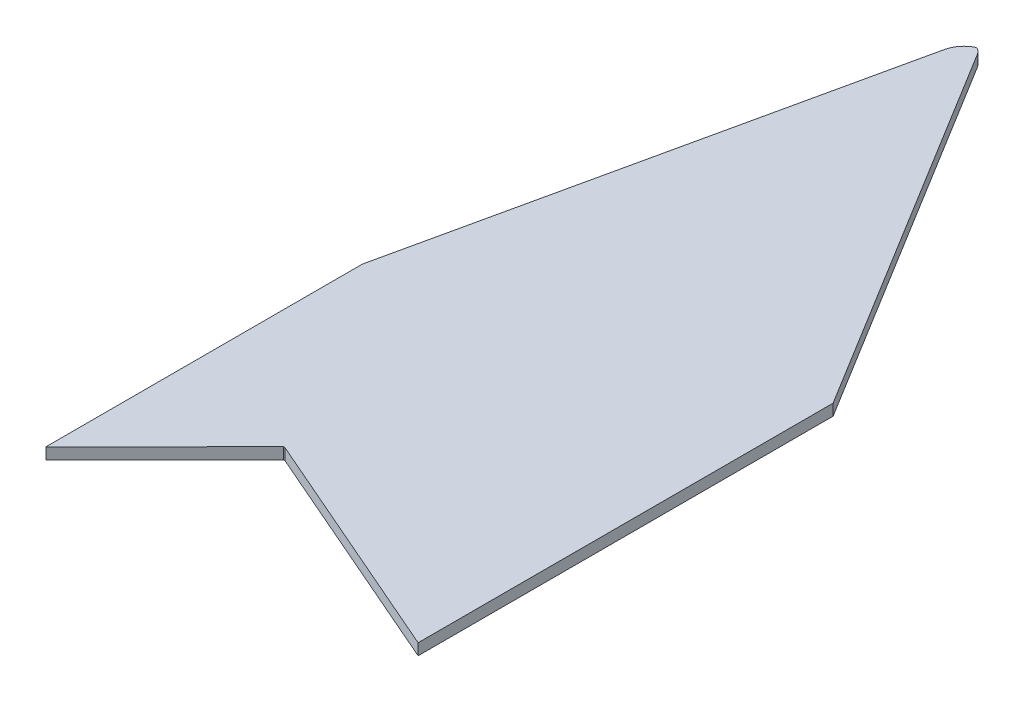
ISO-10303-21;
HEADER;
FILE_DESCRIPTION(('STEP AP214'),'2;1');
FILE_NAME('part.step','',(''),(''),'','','');
FILE_SCHEMA(('AUTOMOTIVE_DESIGN { 1 0 10303 214 1 1 1 1 }'));
ENDSEC;
DATA;
#1=APPLICATION_CONTEXT('core data for automotive mechanical design processes');
#2=APPLICATION_PROTOCOL_DEFINITION('international standard','automotive_design',2000,#1);
#3=PRODUCT_CONTEXT('',#1,'mechanical');
#4=PRODUCT('Part','Part','',(#3));
#5=PRODUCT_RELATED_PRODUCT_CATEGORY('part','',(#4));
#6=PRODUCT_DEFINITION_FORMATION('','',#4);
#7=PRODUCT_DEFINITION_CONTEXT('part definition',#1,'design');
#8=PRODUCT_DEFINITION('design','',#6,#7);
#9=PRODUCT_DEFINITION_SHAPE('','',#8);
#10=(LENGTH_UNIT() NAMED_UNIT(*) SI_UNIT(.MILLI.,.METRE.));
#11=(NAMED_UNIT(*) PLANE_ANGLE_UNIT() SI_UNIT($,.RADIAN.));
#12=(NAMED_UNIT(*) SI_UNIT($,.STERADIAN.) SOLID_ANGLE_UNIT());
#13=UNCERTAINTY_MEASURE_WITH_UNIT(LENGTH_MEASURE(1.E-05),#10,'distance_accuracy_value','');
#14=(GEOMETRIC_REPRESENTATION_CONTEXT(3) GLOBAL_UNCERTAINTY_ASSIGNED_CONTEXT((#13)) GLOBAL_UNIT_ASSIGNED_CONTEXT((#10,
#11,#12)) REPRESENTATION_CONTEXT('',''));
#15=CARTESIAN_POINT('',(0.,0.,0.));
#16=DIRECTION('',(0.,0.,1.));
#17=DIRECTION('',(1.,0.,0.));
#18=AXIS2_PLACEMENT_3D('',#15,#16,#17);
#19=CARTESIAN_POINT('',(17.47942616652,1.27,-10.7409846570753));
#20=DIRECTION('',(-0.85199721938141,0.,0.523546309476388));
#21=DIRECTION('',(0.523546309476388,0.,0.85199721938141));
#22=AXIS2_PLACEMENT_3D('',#19,#20,#21);
#23=PLANE('',#22);
#24=DIRECTION('',(-0.523546309476388,0.,-0.85199721938141));
#25=VECTOR('',#24,1.);
#26=CARTESIAN_POINT('',(17.47942616652,0.,-10.7409846570753));
#27=LINE('',#26,#25);
#28=CARTESIAN_POINT('',(24.1127293444717,0.,0.0537736300779692));
#29=VERTEX_POINT('',#28);
#30=CARTESIAN_POINT('',(-1.77145104882014,0.,-42.0690516518107));
#31=VERTEX_POINT('',#30);
#32=EDGE_CURVE('E143',#29,#31,#27,.T.);
#33=ORIENTED_EDGE('',*,*,#32,.T.);
#34=DIRECTION('',(0.,-1.,0.));
#35=VECTOR('',#34,1.);
#36=CARTESIAN_POINT('',(-1.77145104882014,1.27,-42.0690516518107));
#37=LINE('',#36,#35);
#38=CARTESIAN_POINT('',(-1.77145104882014,1.27,-42.0690516518107));
#39=VERTEX_POINT('',#38);
#40=EDGE_CURVE('E11',#39,#31,#37,.T.);
#41=ORIENTED_EDGE('',*,*,#40,.F.);
#42=DIRECTION('',(-0.523546309476388,0.,-0.85199721938141));
#43=VECTOR('',#42,1.);
#44=CARTESIAN_POINT('',(17.47942616652,1.27,-10.7409846570753));
#45=LINE('',#44,#43);
#46=CARTESIAN_POINT('',(24.1127293444717,1.27,0.0537736300779692));
#47=VERTEX_POINT('',#46);
#48=EDGE_CURVE('E164',#47,#39,#45,.T.);
#49=ORIENTED_EDGE('',*,*,#48,.F.);
#50=DIRECTION('',(0.,-1.,0.));
#51=VECTOR('',#50,1.);
#52=CARTESIAN_POINT('',(24.1127293444717,1.27,0.0537736300779692));
#53=LINE('',#52,#51);
#54=EDGE_CURVE('E139',#47,#29,#53,.T.);
#55=ORIENTED_EDGE('',*,*,#54,.T.);
#56=EDGE_LOOP('',(#33,#41,#49,#55));
#57=FACE_BOUND('',#56,.T.);
#58=ADVANCED_FACE('F41',(#57),#23,.F.);
#59=CARTESIAN_POINT('',(-2.96826414519948,1.27,-41.3336184068555));
#60=DIRECTION('',(0.,-1.,0.));
#61=DIRECTION('',(0.,0.,-1.));
#62=AXIS2_PLACEMENT_3D('',#59,#60,#61);
#63=CYLINDRICAL_SURFACE('',#62,1.40471479149696);
#64=CARTESIAN_POINT('',(-2.96826414519948,0.,-41.3336184068555));
#65=DIRECTION('',(0.,1.,0.));
#66=DIRECTION('',(0.,0.,1.));
#67=AXIS2_PLACEMENT_3D('',#64,#65,#66);
#68=CIRCLE('',#67,1.40471479149696);
#69=CARTESIAN_POINT('',(-2.45286074280754,0.,-42.6403635917532));
#70=VERTEX_POINT('',#69);
#71=EDGE_CURVE('E146',#31,#70,#68,.T.);
#72=ORIENTED_EDGE('',*,*,#71,.T.);
#73=DIRECTION('',(0.,-1.,0.));
#74=VECTOR('',#73,1.);
#75=CARTESIAN_POINT('',(-2.45286074280754,1.27,-42.6403635917532));
#76=LINE('',#75,#74);
#77=CARTESIAN_POINT('',(-2.45286074280754,1.27,-42.6403635917532));
#78=VERTEX_POINT('',#77);
#79=EDGE_CURVE('E49',#78,#70,#76,.T.);
#80=ORIENTED_EDGE('',*,*,#79,.F.);
#81=CARTESIAN_POINT('',(-2.96826414519948,1.27,-41.3336184068555));
#82=DIRECTION('',(0.,1.,0.));
#83=DIRECTION('',(0.,0.,1.));
#84=AXIS2_PLACEMENT_3D('',#81,#82,#83);
#85=CIRCLE('',#84,1.40471479149696);
#86=EDGE_CURVE('E103',#39,#78,#85,.T.);
#87=ORIENTED_EDGE('',*,*,#86,.F.);
#88=ORIENTED_EDGE('',*,*,#40,.T.);
#89=EDGE_LOOP('',(#72,#80,#87,#88));
#90=FACE_BOUND('',#89,.T.);
#91=ADVANCED_FACE('F179',(#90),#63,.T.);
#92=CARTESIAN_POINT('',(-1.20997845007979,1.27,-39.9947419206108));
#93=DIRECTION('',(0.,-1.,0.));
#94=DIRECTION('',(0.,0.,-1.));
#95=AXIS2_PLACEMENT_3D('',#92,#93,#94);
#96=CYLINDRICAL_SURFACE('',#95,2.92302419086715);
#97=CARTESIAN_POINT('',(-1.20997845007979,0.,-39.9947419206108));
#98=DIRECTION('',(0.,1.,0.));
#99=DIRECTION('',(0.,0.,1.));
#100=AXIS2_PLACEMENT_3D('',#97,#98,#99);
#101=CIRCLE('',#100,2.92302419086715);
#102=CARTESIAN_POINT('',(-4.064387109474,0.,-40.6243621438961));
#103=VERTEX_POINT('',#102);
#104=EDGE_CURVE('E149',#103,#70,#101,.F.);
#105=ORIENTED_EDGE('',*,*,#104,.F.);
#106=DIRECTION('',(0.,-1.,0.));
#107=VECTOR('',#106,1.);
#108=CARTESIAN_POINT('',(-4.064387109474,1.27,-40.6243621438961));
#109=LINE('',#108,#107);
#110=CARTESIAN_POINT('',(-4.064387109474,1.27,-40.6243621438961));
#111=VERTEX_POINT('',#110);
#112=EDGE_CURVE('E172',#111,#103,#109,.T.);
#113=ORIENTED_EDGE('',*,*,#112,.F.);
#114=CARTESIAN_POINT('',(-1.20997845007979,1.27,-39.9947419206108));
#115=DIRECTION('',(0.,1.,0.));
#116=DIRECTION('',(0.,0.,1.));
#117=AXIS2_PLACEMENT_3D('',#114,#115,#116);
#118=CIRCLE('',#117,2.92302419086715);
#119=EDGE_CURVE('E178',#111,#78,#118,.F.);
#120=ORIENTED_EDGE('',*,*,#119,.T.);
#121=ORIENTED_EDGE('',*,*,#79,.T.);
#122=EDGE_LOOP('',(#105,#113,#120,#121));
#123=FACE_BOUND('',#122,.T.);
#124=ADVANCED_FACE('F176',(#123),#96,.T.);
#125=CARTESIAN_POINT('',(-12.4208989096152,1.27,-2.73977908493889));
#126=DIRECTION('',(-0.976525842075709,0.,-0.215400277990367));
#127=DIRECTION('',(-0.215400277990367,0.,0.976525842075709));
#128=AXIS2_PLACEMENT_3D('',#125,#126,#127);
#129=PLANE('',#128);
#130=DIRECTION('',(0.215400277990367,0.,-0.976525842075709));
#131=VECTOR('',#130,1.);
#132=CARTESIAN_POINT('',(-12.4208989096152,0.,-2.73977908493889));
#133=LINE('',#132,#131);
#134=CARTESIAN_POINT('',(-15.8872706555283,0.,12.975156938851));
#135=VERTEX_POINT('',#134);
#136=EDGE_CURVE('E152',#135,#103,#133,.T.);
#137=ORIENTED_EDGE('',*,*,#136,.F.);
#138=DIRECTION('',(0.,-1.,0.));
#139=VECTOR('',#138,1.);
#140=CARTESIAN_POINT('',(-15.8872706555283,1.27,12.975156938851));
#141=LINE('',#140,#139);
#142=CARTESIAN_POINT('',(-15.8872706555283,1.27,12.975156938851));
#143=VERTEX_POINT('',#142);
#144=EDGE_CURVE('E170',#143,#135,#141,.T.);
#145=ORIENTED_EDGE('',*,*,#144,.F.);
#146=DIRECTION('',(0.215400277990367,0.,-0.976525842075709));
#147=VECTOR('',#146,1.);
#148=CARTESIAN_POINT('',(-12.4208989096152,1.27,-2.73977908493889));
#149=LINE('',#148,#147);
#150=EDGE_CURVE('E190',#143,#111,#149,.T.);
#151=ORIENTED_EDGE('',*,*,#150,.T.);
#152=ORIENTED_EDGE('',*,*,#112,.T.);
#153=EDGE_LOOP('',(#137,#145,#151,#152));
#154=FACE_BOUND('',#153,.T.);
#155=ADVANCED_FACE('F187',(#154),#129,.T.);
#156=CARTESIAN_POINT('',(-15.8872706555283,1.27,0.));
#157=DIRECTION('',(-1.,0.,0.));
#158=DIRECTION('',(0.,0.,1.));
#159=AXIS2_PLACEMENT_3D('',#156,#157,#158);
#160=PLANE('',#159);
#161=DIRECTION('',(0.,0.,-1.));
#162=VECTOR('',#161,1.);
#163=CARTESIAN_POINT('',(-15.8872706555283,0.,0.));
#164=LINE('',#163,#162);
#165=CARTESIAN_POINT('',(-15.8872706555283,0.,48.546652053357));
#166=VERTEX_POINT('',#165);
#167=EDGE_CURVE('E155',#166,#135,#164,.T.);
#168=ORIENTED_EDGE('',*,*,#167,.F.);
#169=DIRECTION('',(0.,-1.,0.));
#170=VECTOR('',#169,1.);
#171=CARTESIAN_POINT('',(-15.8872706555283,1.27,48.546652053357));
#172=LINE('',#171,#170);
#173=CARTESIAN_POINT('',(-15.8872706555283,1.27,48.546652053357));
#174=VERTEX_POINT('',#173);
#175=EDGE_CURVE('E168',#174,#166,#172,.T.);
#176=ORIENTED_EDGE('',*,*,#175,.F.);
#177=DIRECTION('',(0.,0.,-1.));
#178=VECTOR('',#177,1.);
#179=CARTESIAN_POINT('',(-15.8872706555283,1.27,0.));
#180=LINE('',#179,#178);
#181=EDGE_CURVE('E193',#174,#143,#180,.T.);
#182=ORIENTED_EDGE('',*,*,#181,.T.);
#183=ORIENTED_EDGE('',*,*,#144,.T.);
#184=EDGE_LOOP('',(#168,#176,#182,#183));
#185=FACE_BOUND('',#184,.T.);
#186=ADVANCED_FACE('F224',(#185),#160,.T.);
#187=CARTESIAN_POINT('',(16.3282440274655,1.27,16.3252714733235));
#188=DIRECTION('',(0.707171148452319,0.,0.707042408060951));
#189=DIRECTION('',(0.707042408060951,0.,-0.707171148452319));
#190=AXIS2_PLACEMENT_3D('',#187,#188,#189);
#191=PLANE('',#190);
#192=DIRECTION('',(-0.707042408060951,0.,0.707171148452319));
#193=VECTOR('',#192,1.);
#194=CARTESIAN_POINT('',(16.3282440274655,0.,16.3252714733235));
#195=LINE('',#194,#193);
#196=CARTESIAN_POINT('',(-2.54372552337133,0.,35.2006772886873));
#197=VERTEX_POINT('',#196);
#198=EDGE_CURVE('E158',#197,#166,#195,.T.);
#199=ORIENTED_EDGE('',*,*,#198,.F.);
#200=DIRECTION('',(0.,-1.,0.));
#201=VECTOR('',#200,1.);
#202=CARTESIAN_POINT('',(-2.54372552337133,1.27,35.2006772886873));
#203=LINE('',#202,#201);
#204=CARTESIAN_POINT('',(-2.54372552337133,1.27,35.2006772886873));
#205=VERTEX_POINT('',#204);
#206=EDGE_CURVE('E134',#205,#197,#203,.T.);
#207=ORIENTED_EDGE('',*,*,#206,.F.);
#208=DIRECTION('',(-0.707042408060951,0.,0.707171148452319));
#209=VECTOR('',#208,1.);
#210=CARTESIAN_POINT('',(16.3282440274655,1.27,16.3252714733235));
#211=LINE('',#210,#209);
#212=EDGE_CURVE('E127',#205,#174,#211,.T.);
#213=ORIENTED_EDGE('',*,*,#212,.T.);
#214=ORIENTED_EDGE('',*,*,#175,.T.);
#215=EDGE_LOOP('',(#199,#207,#213,#214));
#216=FACE_BOUND('',#215,.T.);
#217=ADVANCED_FACE('F200',(#216),#191,.T.);
#218=CARTESIAN_POINT('',(0.,1.27,35.2006772886873));
#219=DIRECTION('',(0.,0.,-1.));
#220=DIRECTION('',(-1.,0.,0.));
#221=AXIS2_PLACEMENT_3D('',#218,#219,#220);
#222=PLANE('',#221);
#223=DIRECTION('',(1.,0.,0.));
#224=VECTOR('',#223,1.);
#225=CARTESIAN_POINT('',(0.,0.,35.2006772886873));
#226=LINE('',#225,#224);
#227=CARTESIAN_POINT('',(-2.36199596224373,0.,35.2006772886873));
#228=VERTEX_POINT('',#227);
#229=EDGE_CURVE('E133',#197,#228,#226,.T.);
#230=ORIENTED_EDGE('',*,*,#229,.T.);
#231=DIRECTION('',(0.,-1.,0.));
#232=VECTOR('',#231,1.);
#233=CARTESIAN_POINT('',(-2.36199596224373,1.27,35.2006772886873));
#234=LINE('',#233,#232);
#235=CARTESIAN_POINT('',(-2.36199596224373,1.27,35.2006772886873));
#236=VERTEX_POINT('',#235);
#237=EDGE_CURVE('E130',#236,#228,#234,.T.);
#238=ORIENTED_EDGE('',*,*,#237,.F.);
#239=DIRECTION('',(1.,0.,0.));
#240=VECTOR('',#239,1.);
#241=CARTESIAN_POINT('',(0.,1.27,35.2006772886873));
#242=LINE('',#241,#240);
#243=EDGE_CURVE('E120',#205,#236,#242,.T.);
#244=ORIENTED_EDGE('',*,*,#243,.F.);
#245=ORIENTED_EDGE('',*,*,#206,.T.);
#246=EDGE_LOOP('',(#230,#238,#244,#245));
#247=FACE_BOUND('',#246,.T.);
#248=ADVANCED_FACE('F131',(#247),#222,.F.);
#249=CARTESIAN_POINT('',(-13.2452587681074,1.27,30.4696932626061));
#250=DIRECTION('',(0.398664498608495,0.,-0.91709684196885));
#251=DIRECTION('',(-0.91709684196885,0.,-0.398664498608495));
#252=AXIS2_PLACEMENT_3D('',#249,#250,#251);
#253=PLANE('',#252);
#254=DIRECTION('',(0.91709684196885,0.,0.398664498608495));
#255=VECTOR('',#254,1.);
#256=CARTESIAN_POINT('',(-13.2452587681074,0.,30.4696932626061));
#257=LINE('',#256,#255);
#258=CARTESIAN_POINT('',(24.1127293444717,0.,46.7093125899937));
#259=VERTEX_POINT('',#258);
#260=EDGE_CURVE('E89',#228,#259,#257,.T.);
#261=ORIENTED_EDGE('',*,*,#260,.T.);
#262=DIRECTION('',(0.,-1.,0.));
#263=VECTOR('',#262,1.);
#264=CARTESIAN_POINT('',(24.1127293444717,1.27,46.7093125899937));
#265=LINE('',#264,#263);
#266=CARTESIAN_POINT('',(24.1127293444717,1.27,46.7093125899937));
#267=VERTEX_POINT('',#266);
#268=EDGE_CURVE('E135',#267,#259,#265,.T.);
#269=ORIENTED_EDGE('',*,*,#268,.F.);
#270=DIRECTION('',(0.91709684196885,0.,0.398664498608495));
#271=VECTOR('',#270,1.);
#272=CARTESIAN_POINT('',(-13.2452587681074,1.27,30.4696932626061));
#273=LINE('',#272,#271);
#274=EDGE_CURVE('E124',#236,#267,#273,.T.);
#275=ORIENTED_EDGE('',*,*,#274,.F.);
#276=ORIENTED_EDGE('',*,*,#237,.T.);
#277=EDGE_LOOP('',(#261,#269,#275,#276));
#278=FACE_BOUND('',#277,.T.);
#279=ADVANCED_FACE('F137',(#278),#253,.F.);
#280=CARTESIAN_POINT('',(24.1127293444717,1.27,0.));
#281=DIRECTION('',(-1.,0.,0.));
#282=DIRECTION('',(0.,0.,1.));
#283=AXIS2_PLACEMENT_3D('',#280,#281,#282);
#284=PLANE('',#283);
#285=DIRECTION('',(0.,0.,-1.));
#286=VECTOR('',#285,1.);
#287=CARTESIAN_POINT('',(24.1127293444717,0.,0.));
#288=LINE('',#287,#286);
#289=EDGE_CURVE('E95',#259,#29,#288,.T.);
#290=ORIENTED_EDGE('',*,*,#289,.T.);
#291=ORIENTED_EDGE('',*,*,#54,.F.);
#292=DIRECTION('',(0.,0.,-1.));
#293=VECTOR('',#292,1.);
#294=CARTESIAN_POINT('',(24.1127293444717,1.27,0.));
#295=LINE('',#294,#293);
#296=EDGE_CURVE('E57',#267,#47,#295,.T.);
#297=ORIENTED_EDGE('',*,*,#296,.F.);
#298=ORIENTED_EDGE('',*,*,#268,.T.);
#299=EDGE_LOOP('',(#290,#291,#297,#298));
#300=FACE_BOUND('',#299,.T.);
#301=ADVANCED_FACE('F203',(#300),#284,.F.);
#302=CARTESIAN_POINT('',(0.,1.27,0.));
#303=DIRECTION('',(0.,1.,0.));
#304=DIRECTION('',(0.,0.,1.));
#305=AXIS2_PLACEMENT_3D('',#302,#303,#304);
#306=PLANE('',#305);
#307=ORIENTED_EDGE('',*,*,#48,.T.);
#308=ORIENTED_EDGE('',*,*,#86,.T.);
#309=ORIENTED_EDGE('',*,*,#119,.F.);
#310=ORIENTED_EDGE('',*,*,#150,.F.);
#311=ORIENTED_EDGE('',*,*,#181,.F.);
#312=ORIENTED_EDGE('',*,*,#212,.F.);
#313=ORIENTED_EDGE('',*,*,#243,.T.);
#314=ORIENTED_EDGE('',*,*,#274,.T.);
#315=ORIENTED_EDGE('',*,*,#296,.T.);
#316=EDGE_LOOP('',(#307,#308,#309,#310,#311,#312,#313,#314,#315));
#317=FACE_BOUND('',#316,.T.);
#318=ADVANCED_FACE('F122',(#317),#306,.T.);
#319=CARTESIAN_POINT('',(0.,0.,0.));
#320=DIRECTION('',(0.,1.,0.));
#321=DIRECTION('',(0.,0.,1.));
#322=AXIS2_PLACEMENT_3D('',#319,#320,#321);
#323=PLANE('',#322);
#324=ORIENTED_EDGE('',*,*,#32,.F.);
#325=ORIENTED_EDGE('',*,*,#289,.F.);
#326=ORIENTED_EDGE('',*,*,#260,.F.);
#327=ORIENTED_EDGE('',*,*,#229,.F.);
#328=ORIENTED_EDGE('',*,*,#198,.T.);
#329=ORIENTED_EDGE('',*,*,#167,.T.);
#330=ORIENTED_EDGE('',*,*,#136,.T.);
#331=ORIENTED_EDGE('',*,*,#104,.T.);
#332=ORIENTED_EDGE('',*,*,#71,.F.);
#333=EDGE_LOOP('',(#324,#325,#326,#327,#328,#329,#330,#331,#332));
#334=FACE_BOUND('',#333,.T.);
#335=ADVANCED_FACE('F183',(#334),#323,.F.);
#336=CLOSED_SHELL('',(#58,#91,#124,#155,#186,#217,#248,#279,#301,#318,#335));
#337=MANIFOLD_SOLID_BREP('B2',#336);
#338=ADVANCED_BREP_SHAPE_REPRESENTATION('',(#18,#337),#14);
#339=SHAPE_DEFINITION_REPRESENTATION(#9,#338);
ENDSEC;
END-ISO-10303-21;
